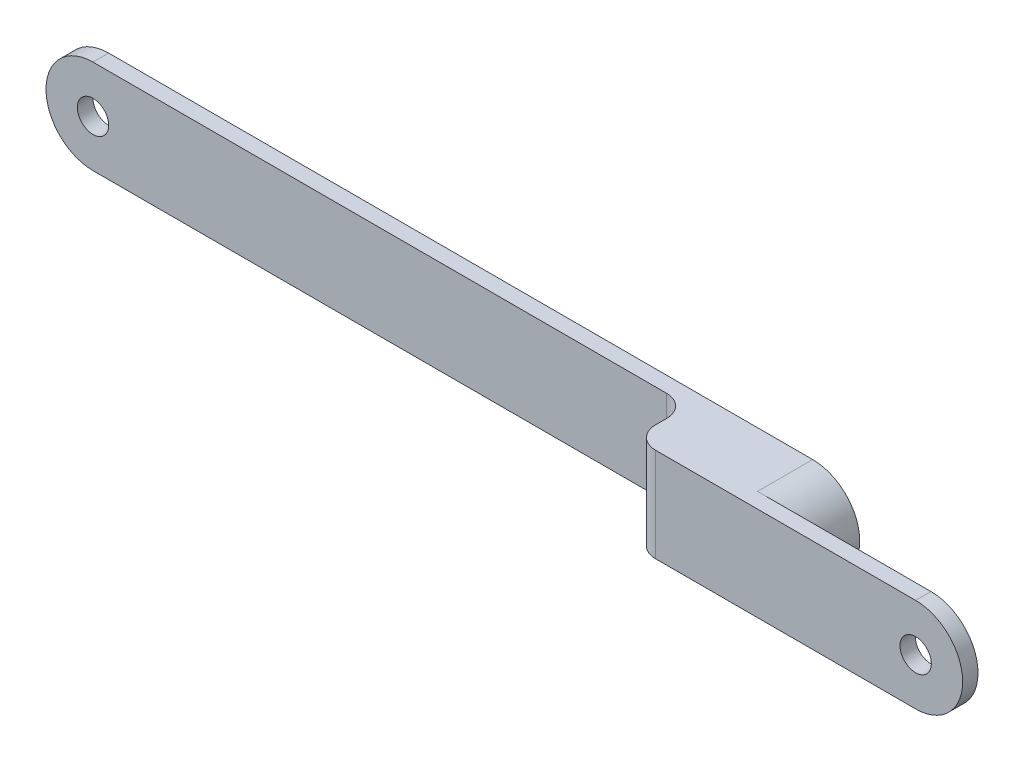
ISO-10303-21;
HEADER;
FILE_DESCRIPTION(('STEP AP214'),'2;1');
FILE_NAME('part.step','',(''),(''),'','','');
FILE_SCHEMA(('AUTOMOTIVE_DESIGN { 1 0 10303 214 1 1 1 1 }'));
ENDSEC;
DATA;
#1=APPLICATION_CONTEXT('core data for automotive mechanical design processes');
#2=APPLICATION_PROTOCOL_DEFINITION('international standard','automotive_design',2000,#1);
#3=PRODUCT_CONTEXT('',#1,'mechanical');
#4=PRODUCT('Part','Part','',(#3));
#5=PRODUCT_RELATED_PRODUCT_CATEGORY('part','',(#4));
#6=PRODUCT_DEFINITION_FORMATION('','',#4);
#7=PRODUCT_DEFINITION_CONTEXT('part definition',#1,'design');
#8=PRODUCT_DEFINITION('design','',#6,#7);
#9=PRODUCT_DEFINITION_SHAPE('','',#8);
#10=(LENGTH_UNIT() NAMED_UNIT(*) SI_UNIT(.MILLI.,.METRE.));
#11=(NAMED_UNIT(*) PLANE_ANGLE_UNIT() SI_UNIT($,.RADIAN.));
#12=(NAMED_UNIT(*) SI_UNIT($,.STERADIAN.) SOLID_ANGLE_UNIT());
#13=UNCERTAINTY_MEASURE_WITH_UNIT(LENGTH_MEASURE(1.E-05),#10,'distance_accuracy_value','');
#14=(GEOMETRIC_REPRESENTATION_CONTEXT(3) GLOBAL_UNCERTAINTY_ASSIGNED_CONTEXT((#13)) GLOBAL_UNIT_ASSIGNED_CONTEXT((#10,
#11,#12)) REPRESENTATION_CONTEXT('',''));
#15=CARTESIAN_POINT('',(0.,0.,0.));
#16=DIRECTION('',(0.,0.,1.));
#17=DIRECTION('',(1.,0.,0.));
#18=AXIS2_PLACEMENT_3D('',#15,#16,#17);
#19=CARTESIAN_POINT('',(0.,15.,45.));
#20=DIRECTION('',(0.,-1.,0.));
#21=DIRECTION('',(0.,0.,-1.));
#22=AXIS2_PLACEMENT_3D('',#19,#20,#21);
#23=PLANE('',#22);
#24=DIRECTION('',(0.,0.,-1.));
#25=VECTOR('',#24,1.);
#26=CARTESIAN_POINT('',(224.645366828327,15.,71.7728992395155));
#27=LINE('',#26,#25);
#28=CARTESIAN_POINT('',(224.645366828327,15.,17.6));
#29=VERTEX_POINT('',#28);
#30=CARTESIAN_POINT('',(224.645366828327,15.,0.));
#31=VERTEX_POINT('',#30);
#32=EDGE_CURVE('E117',#29,#31,#27,.T.);
#33=ORIENTED_EDGE('',*,*,#32,.T.);
#34=DIRECTION('',(-1.,0.,0.));
#35=VECTOR('',#34,1.);
#36=CARTESIAN_POINT('',(0.,15.,0.));
#37=LINE('',#36,#35);
#38=CARTESIAN_POINT('',(0.,15.,0.));
#39=VERTEX_POINT('',#38);
#40=EDGE_CURVE('E128',#31,#39,#37,.T.);
#41=ORIENTED_EDGE('',*,*,#40,.T.);
#42=DIRECTION('',(0.,0.,-1.));
#43=VECTOR('',#42,1.);
#44=CARTESIAN_POINT('',(0.,15.,45.));
#45=LINE('',#44,#43);
#46=CARTESIAN_POINT('',(0.,15.,5.00000000000004));
#47=VERTEX_POINT('',#46);
#48=EDGE_CURVE('E134',#47,#39,#45,.T.);
#49=ORIENTED_EDGE('',*,*,#48,.F.);
#50=DIRECTION('',(-1.,0.,0.));
#51=VECTOR('',#50,1.);
#52=CARTESIAN_POINT('',(0.,15.,5.00000000000004));
#53=LINE('',#52,#51);
#54=CARTESIAN_POINT('',(183.,15.,5.00000000000006));
#55=VERTEX_POINT('',#54);
#56=EDGE_CURVE('E152',#55,#47,#53,.T.);
#57=ORIENTED_EDGE('',*,*,#56,.F.);
#58=CARTESIAN_POINT('',(183.,15.,12.0000000000001));
#59=DIRECTION('',(0.,-1.,0.));
#60=DIRECTION('',(0.,0.,-1.));
#61=AXIS2_PLACEMENT_3D('',#58,#59,#60);
#62=CIRCLE('',#61,7.);
#63=CARTESIAN_POINT('',(190.,15.,12.0000000000001));
#64=VERTEX_POINT('',#63);
#65=EDGE_CURVE('E174',#55,#64,#62,.T.);
#66=ORIENTED_EDGE('',*,*,#65,.T.);
#67=DIRECTION('',(0.,0.,-1.));
#68=VECTOR('',#67,1.);
#69=CARTESIAN_POINT('',(190.,15.,45.));
#70=LINE('',#69,#68);
#71=CARTESIAN_POINT('',(190.,15.,15.5));
#72=VERTEX_POINT('',#71);
#73=EDGE_CURVE('E156',#72,#64,#70,.T.);
#74=ORIENTED_EDGE('',*,*,#73,.F.);
#75=CARTESIAN_POINT('',(197.,15.,15.5));
#76=DIRECTION('',(0.,-1.,0.));
#77=DIRECTION('',(0.,0.,-1.));
#78=AXIS2_PLACEMENT_3D('',#75,#76,#77);
#79=CIRCLE('',#78,7.);
#80=CARTESIAN_POINT('',(197.,15.,22.5));
#81=VERTEX_POINT('',#80);
#82=EDGE_CURVE('E169',#72,#81,#79,.F.);
#83=ORIENTED_EDGE('',*,*,#82,.T.);
#84=DIRECTION('',(-1.,0.,0.));
#85=VECTOR('',#84,1.);
#86=CARTESIAN_POINT('',(0.,15.,22.5000000000001));
#87=LINE('',#86,#85);
#88=CARTESIAN_POINT('',(280.,15.,22.5000000000001));
#89=VERTEX_POINT('',#88);
#90=EDGE_CURVE('E144',#89,#81,#87,.T.);
#91=ORIENTED_EDGE('',*,*,#90,.F.);
#92=DIRECTION('',(0.,0.,1.));
#93=VECTOR('',#92,1.);
#94=CARTESIAN_POINT('',(280.,15.,-99.6242942258564));
#95=LINE('',#94,#93);
#96=CARTESIAN_POINT('',(280.,15.,17.6));
#97=VERTEX_POINT('',#96);
#98=EDGE_CURVE('E191',#97,#89,#95,.T.);
#99=ORIENTED_EDGE('',*,*,#98,.F.);
#100=DIRECTION('',(-1.,0.,0.));
#101=VECTOR('',#100,1.);
#102=CARTESIAN_POINT('',(280.,15.,17.6));
#103=LINE('',#102,#101);
#104=EDGE_CURVE('E12',#97,#29,#103,.T.);
#105=ORIENTED_EDGE('',*,*,#104,.T.);
#106=EDGE_LOOP('',(#33,#41,#49,#57,#66,#74,#83,#91,#99,#105));
#107=FACE_BOUND('',#106,.T.);
#108=ADVANCED_FACE('F36',(#107),#23,.F.);
#109=CARTESIAN_POINT('',(280.,0.,-99.6242942258564));
#110=DIRECTION('',(0.,0.,1.));
#111=DIRECTION('',(1.,0.,0.));
#112=AXIS2_PLACEMENT_3D('',#109,#110,#111);
#113=CYLINDRICAL_SURFACE('',#112,15.);
#114=DIRECTION('',(0.,0.,1.));
#115=VECTOR('',#114,1.);
#116=CARTESIAN_POINT('',(280.,-15.,-99.6242942258564));
#117=LINE('',#116,#115);
#118=CARTESIAN_POINT('',(280.,-15.,17.6));
#119=VERTEX_POINT('',#118);
#120=CARTESIAN_POINT('',(280.,-15.,22.5000000000001));
#121=VERTEX_POINT('',#120);
#122=EDGE_CURVE('E179',#119,#121,#117,.T.);
#123=ORIENTED_EDGE('',*,*,#122,.F.);
#124=CARTESIAN_POINT('',(280.,0.,17.6));
#125=DIRECTION('',(0.,0.,-1.));
#126=DIRECTION('',(-1.,0.,0.));
#127=AXIS2_PLACEMENT_3D('',#124,#125,#126);
#128=CIRCLE('',#127,15.);
#129=EDGE_CURVE('E182',#97,#119,#128,.T.);
#130=ORIENTED_EDGE('',*,*,#129,.F.);
#131=ORIENTED_EDGE('',*,*,#98,.T.);
#132=CARTESIAN_POINT('',(280.,0.,22.5000000000001));
#133=DIRECTION('',(0.,0.,1.));
#134=DIRECTION('',(-1.,0.,0.));
#135=AXIS2_PLACEMENT_3D('',#132,#133,#134);
#136=CIRCLE('',#135,15.);
#137=EDGE_CURVE('E185',#121,#89,#136,.T.);
#138=ORIENTED_EDGE('',*,*,#137,.F.);
#139=EDGE_LOOP('',(#123,#130,#131,#138));
#140=FACE_BOUND('',#139,.T.);
#141=ADVANCED_FACE('F189',(#140),#113,.T.);
#142=CARTESIAN_POINT('',(0.,0.,45.));
#143=DIRECTION('',(0.,0.,-1.));
#144=DIRECTION('',(-1.,0.,0.));
#145=AXIS2_PLACEMENT_3D('',#142,#143,#144);
#146=CYLINDRICAL_SURFACE('',#145,15.);
#147=CARTESIAN_POINT('',(0.,0.,5.00000000000004));
#148=DIRECTION('',(0.,0.,1.));
#149=DIRECTION('',(1.,0.,0.));
#150=AXIS2_PLACEMENT_3D('',#147,#148,#149);
#151=CIRCLE('',#150,15.);
#152=CARTESIAN_POINT('',(0.,-15.,5.00000000000003));
#153=VERTEX_POINT('',#152);
#154=EDGE_CURVE('E148',#47,#153,#151,.T.);
#155=ORIENTED_EDGE('',*,*,#154,.F.);
#156=ORIENTED_EDGE('',*,*,#48,.T.);
#157=CARTESIAN_POINT('',(0.,0.,0.));
#158=DIRECTION('',(0.,0.,1.));
#159=DIRECTION('',(1.,0.,0.));
#160=AXIS2_PLACEMENT_3D('',#157,#158,#159);
#161=CIRCLE('',#160,15.);
#162=CARTESIAN_POINT('',(0.,-15.,0.));
#163=VERTEX_POINT('',#162);
#164=EDGE_CURVE('E133',#39,#163,#161,.T.);
#165=ORIENTED_EDGE('',*,*,#164,.T.);
#166=DIRECTION('',(0.,0.,-1.));
#167=VECTOR('',#166,1.);
#168=CARTESIAN_POINT('',(0.,-15.,45.));
#169=LINE('',#168,#167);
#170=EDGE_CURVE('E137',#153,#163,#169,.T.);
#171=ORIENTED_EDGE('',*,*,#170,.F.);
#172=EDGE_LOOP('',(#155,#156,#165,#171));
#173=FACE_BOUND('',#172,.T.);
#174=ADVANCED_FACE('F207',(#173),#146,.T.);
#175=CARTESIAN_POINT('',(0.,-15.,45.));
#176=DIRECTION('',(0.,1.,0.));
#177=DIRECTION('',(0.,0.,1.));
#178=AXIS2_PLACEMENT_3D('',#175,#176,#177);
#179=PLANE('',#178);
#180=DIRECTION('',(1.,0.,0.));
#181=VECTOR('',#180,1.);
#182=CARTESIAN_POINT('',(0.,-15.,0.));
#183=LINE('',#182,#181);
#184=CARTESIAN_POINT('',(224.645366828327,-15.,0.));
#185=VERTEX_POINT('',#184);
#186=EDGE_CURVE('E135',#163,#185,#183,.T.);
#187=ORIENTED_EDGE('',*,*,#186,.T.);
#188=DIRECTION('',(0.,0.,-1.));
#189=VECTOR('',#188,1.);
#190=CARTESIAN_POINT('',(224.645366828327,-15.,71.7728992395155));
#191=LINE('',#190,#189);
#192=CARTESIAN_POINT('',(224.645366828327,-15.,17.6));
#193=VERTEX_POINT('',#192);
#194=EDGE_CURVE('E119',#193,#185,#191,.T.);
#195=ORIENTED_EDGE('',*,*,#194,.F.);
#196=DIRECTION('',(1.,0.,0.));
#197=VECTOR('',#196,1.);
#198=CARTESIAN_POINT('',(280.,-15.,17.6));
#199=LINE('',#198,#197);
#200=EDGE_CURVE('E44',#193,#119,#199,.T.);
#201=ORIENTED_EDGE('',*,*,#200,.T.);
#202=ORIENTED_EDGE('',*,*,#122,.T.);
#203=DIRECTION('',(-1.,0.,0.));
#204=VECTOR('',#203,1.);
#205=CARTESIAN_POINT('',(215.,-15.,22.5));
#206=LINE('',#205,#204);
#207=CARTESIAN_POINT('',(197.,-15.,22.5));
#208=VERTEX_POINT('',#207);
#209=EDGE_CURVE('E193',#121,#208,#206,.T.);
#210=ORIENTED_EDGE('',*,*,#209,.T.);
#211=CARTESIAN_POINT('',(197.,-15.,15.5));
#212=DIRECTION('',(0.,1.,0.));
#213=DIRECTION('',(0.,0.,1.));
#214=AXIS2_PLACEMENT_3D('',#211,#212,#213);
#215=CIRCLE('',#214,7.);
#216=CARTESIAN_POINT('',(190.,-15.,15.5));
#217=VERTEX_POINT('',#216);
#218=EDGE_CURVE('E162',#208,#217,#215,.F.);
#219=ORIENTED_EDGE('',*,*,#218,.T.);
#220=DIRECTION('',(0.,0.,-1.));
#221=VECTOR('',#220,1.);
#222=CARTESIAN_POINT('',(190.,-15.,22.5));
#223=LINE('',#222,#221);
#224=CARTESIAN_POINT('',(190.,-15.,12.0000000000001));
#225=VERTEX_POINT('',#224);
#226=EDGE_CURVE('E198',#217,#225,#223,.T.);
#227=ORIENTED_EDGE('',*,*,#226,.T.);
#228=CARTESIAN_POINT('',(183.,-15.,12.0000000000001));
#229=DIRECTION('',(0.,1.,0.));
#230=DIRECTION('',(0.,0.,1.));
#231=AXIS2_PLACEMENT_3D('',#228,#229,#230);
#232=CIRCLE('',#231,7.);
#233=CARTESIAN_POINT('',(183.,-15.,5.00000000000005));
#234=VERTEX_POINT('',#233);
#235=EDGE_CURVE('E172',#225,#234,#232,.T.);
#236=ORIENTED_EDGE('',*,*,#235,.T.);
#237=DIRECTION('',(-1.,0.,0.));
#238=VECTOR('',#237,1.);
#239=CARTESIAN_POINT('',(190.,-15.,5.00000000000005));
#240=LINE('',#239,#238);
#241=EDGE_CURVE('E153',#234,#153,#240,.T.);
#242=ORIENTED_EDGE('',*,*,#241,.T.);
#243=ORIENTED_EDGE('',*,*,#170,.T.);
#244=EDGE_LOOP('',(#187,#195,#201,#202,#210,#219,#227,#236,#242,#243));
#245=FACE_BOUND('',#244,.T.);
#246=ADVANCED_FACE('F176',(#245),#179,.F.);
#247=CARTESIAN_POINT('',(0.,0.,-45.));
#248=DIRECTION('',(0.,0.,1.));
#249=DIRECTION('',(1.,0.,0.));
#250=AXIS2_PLACEMENT_3D('',#247,#248,#249);
#251=CYLINDRICAL_SURFACE('',#250,5.);
#252=CARTESIAN_POINT('',(0.,0.,0.));
#253=DIRECTION('',(0.,0.,1.));
#254=DIRECTION('',(1.,0.,0.));
#255=AXIS2_PLACEMENT_3D('',#252,#253,#254);
#256=CIRCLE('',#255,5.);
#257=CARTESIAN_POINT('',(5.,0.,0.));
#258=VERTEX_POINT('',#257);
#259=EDGE_CURVE('E145',#258,#258,#256,.T.);
#260=CARTESIAN_POINT('',(0.,0.,5.00000000000003));
#261=DIRECTION('',(0.,0.,1.));
#262=DIRECTION('',(1.,0.,0.));
#263=AXIS2_PLACEMENT_3D('',#260,#261,#262);
#264=CIRCLE('',#263,5.);
#265=CARTESIAN_POINT('',(5.,0.,5.00000000000003));
#266=VERTEX_POINT('',#265);
#267=EDGE_CURVE('E149',#266,#266,#264,.F.);
#268=CARTESIAN_POINT('',(5.,0.,0.));
#269=CARTESIAN_POINT('',(5.,0.,0.0520833333333345));
#270=CARTESIAN_POINT('',(5.,0.,0.104166666666669));
#271=CARTESIAN_POINT('',(5.,0.,0.208333333333336));
#272=CARTESIAN_POINT('',(5.,0.,0.260416666666668));
#273=CARTESIAN_POINT('',(5.,0.,0.364583333333335));
#274=CARTESIAN_POINT('',(5.,0.,0.416666666666669));
#275=CARTESIAN_POINT('',(5.,0.,0.520833333333336));
#276=CARTESIAN_POINT('',(5.,0.,0.572916666666668));
#277=CARTESIAN_POINT('',(5.,0.,0.677083333333335));
#278=CARTESIAN_POINT('',(5.,0.,0.72916666666667));
#279=CARTESIAN_POINT('',(5.,0.,0.833333333333339));
#280=CARTESIAN_POINT('',(5.,0.,0.885416666666673));
#281=CARTESIAN_POINT('',(5.,0.,0.98958333333334));
#282=CARTESIAN_POINT('',(5.,0.,1.04166666666667));
#283=CARTESIAN_POINT('',(5.,0.,1.14583333333334));
#284=CARTESIAN_POINT('',(5.,0.,1.19791666666667));
#285=CARTESIAN_POINT('',(5.,0.,1.30208333333334));
#286=CARTESIAN_POINT('',(5.,0.,1.35416666666668));
#287=CARTESIAN_POINT('',(5.,0.,1.45833333333334));
#288=CARTESIAN_POINT('',(5.,0.,1.51041666666668));
#289=CARTESIAN_POINT('',(5.,0.,1.61458333333334));
#290=CARTESIAN_POINT('',(5.,0.,1.66666666666668));
#291=CARTESIAN_POINT('',(5.,0.,1.77083333333335));
#292=CARTESIAN_POINT('',(5.,0.,1.82291666666668));
#293=CARTESIAN_POINT('',(5.,0.,1.92708333333335));
#294=CARTESIAN_POINT('',(5.,0.,1.97916666666668));
#295=CARTESIAN_POINT('',(5.,0.,2.08333333333335));
#296=CARTESIAN_POINT('',(5.,0.,2.13541666666668));
#297=CARTESIAN_POINT('',(5.,0.,2.23958333333335));
#298=CARTESIAN_POINT('',(5.,0.,2.29166666666668));
#299=CARTESIAN_POINT('',(5.,0.,2.39583333333335));
#300=CARTESIAN_POINT('',(5.,0.,2.44791666666668));
#301=CARTESIAN_POINT('',(5.,0.,2.55208333333335));
#302=CARTESIAN_POINT('',(5.,0.,2.60416666666669));
#303=CARTESIAN_POINT('',(5.,0.,2.70833333333335));
#304=CARTESIAN_POINT('',(5.,0.,2.76041666666668));
#305=CARTESIAN_POINT('',(5.,0.,2.86458333333335));
#306=CARTESIAN_POINT('',(5.,0.,2.91666666666669));
#307=CARTESIAN_POINT('',(5.,0.,3.02083333333335));
#308=CARTESIAN_POINT('',(5.,0.,3.07291666666668));
#309=CARTESIAN_POINT('',(5.,0.,3.17708333333335));
#310=CARTESIAN_POINT('',(5.,0.,3.22916666666669));
#311=CARTESIAN_POINT('',(5.,0.,3.33333333333335));
#312=CARTESIAN_POINT('',(5.,0.,3.38541666666669));
#313=CARTESIAN_POINT('',(5.,0.,3.48958333333336));
#314=CARTESIAN_POINT('',(5.,0.,3.54166666666669));
#315=CARTESIAN_POINT('',(5.,0.,3.64583333333336));
#316=CARTESIAN_POINT('',(5.,0.,3.69791666666669));
#317=CARTESIAN_POINT('',(5.,0.,3.80208333333336));
#318=CARTESIAN_POINT('',(5.,0.,3.85416666666669));
#319=CARTESIAN_POINT('',(5.,0.,3.95833333333336));
#320=CARTESIAN_POINT('',(5.,0.,4.01041666666669));
#321=CARTESIAN_POINT('',(5.,0.,4.11458333333336));
#322=CARTESIAN_POINT('',(5.,0.,4.16666666666669));
#323=CARTESIAN_POINT('',(5.,0.,4.27083333333336));
#324=CARTESIAN_POINT('',(5.,0.,4.3229166666667));
#325=CARTESIAN_POINT('',(5.,0.,4.42708333333336));
#326=CARTESIAN_POINT('',(5.,0.,4.4791666666667));
#327=CARTESIAN_POINT('',(5.,0.,4.58333333333336));
#328=CARTESIAN_POINT('',(5.,0.,4.6354166666667));
#329=CARTESIAN_POINT('',(5.,0.,4.73958333333336));
#330=CARTESIAN_POINT('',(5.,0.,4.7916666666667));
#331=CARTESIAN_POINT('',(5.,0.,4.89583333333336));
#332=CARTESIAN_POINT('',(5.,0.,4.9479166666667));
#333=CARTESIAN_POINT('',(5.,0.,5.00000000000003));
#334=B_SPLINE_CURVE_WITH_KNOTS('',3,(#268,#269,#270,#271,#272,#273,#274,#275,#276,#277,#278,
#279,#280,#281,#282,#283,#284,#285,#286,#287,#288,#289,#290,#291,#292,#293,#294,#295,#296,#297,
#298,#299,#300,#301,#302,#303,#304,#305,#306,#307,#308,#309,#310,#311,#312,#313,#314,#315,#316,
#317,#318,#319,#320,#321,#322,#323,#324,#325,#326,#327,#328,#329,#330,#331,#332,#333),
.UNSPECIFIED.,.F.,.F.,(4,2,2,2,2,2,2,2,2,2,2,2,2,2,2,2,2,2,2,2,2,2,2,2,2,2,2,2,2,2,2,2,4),(0.,
0.156250000000004,0.3125,0.468750000000004,0.625000000000001,0.781250000000004,
0.937500000000008,1.09375,1.25000000000001,1.40625000000001,1.56250000000001,1.71875000000001,
1.87500000000002,2.03125000000001,2.18750000000002,2.34375000000001,2.50000000000002,
2.65625000000002,2.81250000000002,2.96875000000002,3.12500000000002,3.28125000000002,
3.43750000000002,3.59375000000002,3.75000000000002,3.90625000000003,4.06250000000002,
4.21875000000003,4.37500000000003,4.53125000000003,4.68750000000003,4.84375000000003,
5.00000000000003),.UNSPECIFIED.);
#335=EDGE_CURVE('BSEAM246',#258,#266,#334,.T.);
#336=ORIENTED_EDGE('',*,*,#259,.F.);
#337=ORIENTED_EDGE('',*,*,#267,.F.);
#338=ORIENTED_EDGE('',*,*,#335,.T.);
#339=ORIENTED_EDGE('',*,*,#335,.F.);
#340=EDGE_LOOP('',(#336,#338,#337,#339));
#341=FACE_BOUND('',#340,.T.);
#342=ADVANCED_FACE('F246',(#341),#251,.F.);
#343=CARTESIAN_POINT('',(0.,0.,0.));
#344=DIRECTION('',(0.,0.,1.));
#345=DIRECTION('',(1.,0.,0.));
#346=AXIS2_PLACEMENT_3D('',#343,#344,#345);
#347=PLANE('',#346);
#348=ORIENTED_EDGE('',*,*,#259,.T.);
#349=EDGE_LOOP('',(#348));
#350=FACE_BOUND('',#349,.T.);
#351=ORIENTED_EDGE('',*,*,#40,.F.);
#352=CARTESIAN_POINT('',(224.645366828327,0.,0.));
#353=DIRECTION('',(0.,0.,1.));
#354=DIRECTION('',(1.,0.,0.));
#355=AXIS2_PLACEMENT_3D('',#352,#353,#354);
#356=CIRCLE('',#355,15.);
#357=EDGE_CURVE('E113',#185,#31,#356,.T.);
#358=ORIENTED_EDGE('',*,*,#357,.F.);
#359=ORIENTED_EDGE('',*,*,#186,.F.);
#360=ORIENTED_EDGE('',*,*,#164,.F.);
#361=EDGE_LOOP('',(#351,#358,#359,#360));
#362=FACE_BOUND('',#361,.T.);
#363=ADVANCED_FACE('F132',(#350,#362),#347,.F.);
#364=CARTESIAN_POINT('',(190.,35.,22.5));
#365=DIRECTION('',(-1.,0.,0.));
#366=DIRECTION('',(0.,0.,1.));
#367=AXIS2_PLACEMENT_3D('',#364,#365,#366);
#368=PLANE('',#367);
#369=ORIENTED_EDGE('',*,*,#226,.F.);
#370=DIRECTION('',(0.,-1.,0.));
#371=VECTOR('',#370,1.);
#372=CARTESIAN_POINT('',(190.,35.,15.5));
#373=LINE('',#372,#371);
#374=EDGE_CURVE('E167',#217,#72,#373,.F.);
#375=ORIENTED_EDGE('',*,*,#374,.T.);
#376=ORIENTED_EDGE('',*,*,#73,.T.);
#377=DIRECTION('',(0.,-1.,0.));
#378=VECTOR('',#377,1.);
#379=CARTESIAN_POINT('',(190.,-15.,12.0000000000001));
#380=LINE('',#379,#378);
#381=EDGE_CURVE('E164',#64,#225,#380,.T.);
#382=ORIENTED_EDGE('',*,*,#381,.T.);
#383=EDGE_LOOP('',(#369,#375,#376,#382));
#384=FACE_BOUND('',#383,.T.);
#385=ADVANCED_FACE('F215',(#384),#368,.T.);
#386=CARTESIAN_POINT('',(215.,35.,22.5));
#387=DIRECTION('',(0.,0.,1.));
#388=DIRECTION('',(1.,0.,0.));
#389=AXIS2_PLACEMENT_3D('',#386,#387,#388);
#390=PLANE('',#389);
#391=CARTESIAN_POINT('',(280.,0.,22.5));
#392=DIRECTION('',(0.,0.,1.));
#393=DIRECTION('',(1.,0.,0.));
#394=AXIS2_PLACEMENT_3D('',#391,#392,#393);
#395=CIRCLE('',#394,4.99999999999999);
#396=CARTESIAN_POINT('',(275.,0.,22.5));
#397=VERTEX_POINT('',#396);
#398=EDGE_CURVE('E124',#397,#397,#395,.T.);
#399=ORIENTED_EDGE('',*,*,#398,.F.);
#400=EDGE_LOOP('',(#399));
#401=FACE_BOUND('',#400,.T.);
#402=ORIENTED_EDGE('',*,*,#209,.F.);
#403=ORIENTED_EDGE('',*,*,#137,.T.);
#404=ORIENTED_EDGE('',*,*,#90,.T.);
#405=DIRECTION('',(0.,-1.,0.));
#406=VECTOR('',#405,1.);
#407=CARTESIAN_POINT('',(197.,35.,22.5));
#408=LINE('',#407,#406);
#409=EDGE_CURVE('E159',#81,#208,#408,.T.);
#410=ORIENTED_EDGE('',*,*,#409,.T.);
#411=EDGE_LOOP('',(#402,#403,#404,#410));
#412=FACE_BOUND('',#411,.T.);
#413=ADVANCED_FACE('F222',(#401,#412),#390,.T.);
#414=CARTESIAN_POINT('',(190.,35.,5.00000000000005));
#415=DIRECTION('',(0.,0.,1.));
#416=DIRECTION('',(1.,0.,0.));
#417=AXIS2_PLACEMENT_3D('',#414,#415,#416);
#418=PLANE('',#417);
#419=ORIENTED_EDGE('',*,*,#267,.T.);
#420=EDGE_LOOP('',(#419));
#421=FACE_BOUND('',#420,.T.);
#422=ORIENTED_EDGE('',*,*,#241,.F.);
#423=DIRECTION('',(0.,-1.,0.));
#424=VECTOR('',#423,1.);
#425=CARTESIAN_POINT('',(183.,15.,5.00000000000005));
#426=LINE('',#425,#424);
#427=EDGE_CURVE('E57',#234,#55,#426,.F.);
#428=ORIENTED_EDGE('',*,*,#427,.T.);
#429=ORIENTED_EDGE('',*,*,#56,.T.);
#430=ORIENTED_EDGE('',*,*,#154,.T.);
#431=EDGE_LOOP('',(#422,#428,#429,#430));
#432=FACE_BOUND('',#431,.T.);
#433=ADVANCED_FACE('F208',(#421,#432),#418,.T.);
#434=CARTESIAN_POINT('',(197.,35.,15.5));
#435=DIRECTION('',(0.,-1.,0.));
#436=DIRECTION('',(0.,0.,-1.));
#437=AXIS2_PLACEMENT_3D('',#434,#435,#436);
#438=CYLINDRICAL_SURFACE('',#437,7.);
#439=ORIENTED_EDGE('',*,*,#82,.F.);
#440=ORIENTED_EDGE('',*,*,#374,.F.);
#441=ORIENTED_EDGE('',*,*,#218,.F.);
#442=ORIENTED_EDGE('',*,*,#409,.F.);
#443=EDGE_LOOP('',(#439,#440,#441,#442));
#444=FACE_BOUND('',#443,.T.);
#445=ADVANCED_FACE('F220',(#444),#438,.T.);
#446=CARTESIAN_POINT('',(183.,35.,12.0000000000001));
#447=DIRECTION('',(0.,1.,0.));
#448=DIRECTION('',(0.,0.,1.));
#449=AXIS2_PLACEMENT_3D('',#446,#447,#448);
#450=CYLINDRICAL_SURFACE('',#449,7.);
#451=ORIENTED_EDGE('',*,*,#65,.F.);
#452=ORIENTED_EDGE('',*,*,#427,.F.);
#453=ORIENTED_EDGE('',*,*,#235,.F.);
#454=ORIENTED_EDGE('',*,*,#381,.F.);
#455=EDGE_LOOP('',(#451,#452,#453,#454));
#456=FACE_BOUND('',#455,.T.);
#457=ADVANCED_FACE('F38',(#456),#450,.F.);
#458=CARTESIAN_POINT('',(280.,0.,17.6));
#459=DIRECTION('',(0.,0.,-1.));
#460=DIRECTION('',(-1.,0.,0.));
#461=AXIS2_PLACEMENT_3D('',#458,#459,#460);
#462=PLANE('',#461);
#463=CARTESIAN_POINT('',(280.,0.,17.6));
#464=DIRECTION('',(0.,0.,-1.));
#465=DIRECTION('',(-1.,0.,0.));
#466=AXIS2_PLACEMENT_3D('',#463,#464,#465);
#467=CIRCLE('',#466,4.99999999999999);
#468=CARTESIAN_POINT('',(275.,0.,17.6));
#469=VERTEX_POINT('',#468);
#470=EDGE_CURVE('E271',#469,#469,#467,.T.);
#471=ORIENTED_EDGE('',*,*,#470,.F.);
#472=EDGE_LOOP('',(#471));
#473=FACE_BOUND('',#472,.T.);
#474=ORIENTED_EDGE('',*,*,#129,.T.);
#475=ORIENTED_EDGE('',*,*,#200,.F.);
#476=CARTESIAN_POINT('',(224.645366828327,0.,17.6));
#477=DIRECTION('',(0.,0.,-1.));
#478=DIRECTION('',(-1.,0.,0.));
#479=AXIS2_PLACEMENT_3D('',#476,#477,#478);
#480=CIRCLE('',#479,15.);
#481=EDGE_CURVE('E186',#29,#193,#480,.T.);
#482=ORIENTED_EDGE('',*,*,#481,.F.);
#483=ORIENTED_EDGE('',*,*,#104,.F.);
#484=EDGE_LOOP('',(#474,#475,#482,#483));
#485=FACE_BOUND('',#484,.T.);
#486=ADVANCED_FACE('F183',(#473,#485),#462,.T.);
#487=CARTESIAN_POINT('',(224.645366828327,0.,71.7728992395155));
#488=DIRECTION('',(0.,0.,-1.));
#489=DIRECTION('',(-1.,0.,0.));
#490=AXIS2_PLACEMENT_3D('',#487,#488,#489);
#491=CYLINDRICAL_SURFACE('',#490,15.);
#492=ORIENTED_EDGE('',*,*,#481,.T.);
#493=ORIENTED_EDGE('',*,*,#194,.T.);
#494=ORIENTED_EDGE('',*,*,#357,.T.);
#495=ORIENTED_EDGE('',*,*,#32,.F.);
#496=EDGE_LOOP('',(#492,#493,#494,#495));
#497=FACE_BOUND('',#496,.T.);
#498=ADVANCED_FACE('F116',(#497),#491,.T.);
#499=CARTESIAN_POINT('',(280.,0.,32.6));
#500=DIRECTION('',(0.,0.,-1.));
#501=DIRECTION('',(-1.,0.,0.));
#502=AXIS2_PLACEMENT_3D('',#499,#500,#501);
#503=CYLINDRICAL_SURFACE('',#502,4.99999999999999);
#504=CARTESIAN_POINT('',(275.,0.,22.5));
#505=CARTESIAN_POINT('',(275.,0.,22.4489583333333));
#506=CARTESIAN_POINT('',(275.,0.,22.3979166666667));
#507=CARTESIAN_POINT('',(275.,0.,22.2958333333333));
#508=CARTESIAN_POINT('',(275.,0.,22.2447916666667));
#509=CARTESIAN_POINT('',(275.,0.,22.1427083333333));
#510=CARTESIAN_POINT('',(275.,0.,22.0916666666667));
#511=CARTESIAN_POINT('',(275.,0.,21.9895833333333));
#512=CARTESIAN_POINT('',(275.,0.,21.9385416666667));
#513=CARTESIAN_POINT('',(275.,0.,21.8364583333333));
#514=CARTESIAN_POINT('',(275.,0.,21.7854166666667));
#515=CARTESIAN_POINT('',(275.,0.,21.6833333333333));
#516=CARTESIAN_POINT('',(275.,0.,21.6322916666667));
#517=CARTESIAN_POINT('',(275.,0.,21.5302083333333));
#518=CARTESIAN_POINT('',(275.,0.,21.4791666666667));
#519=CARTESIAN_POINT('',(275.,0.,21.3770833333333));
#520=CARTESIAN_POINT('',(275.,0.,21.3260416666667));
#521=CARTESIAN_POINT('',(275.,0.,21.2239583333333));
#522=CARTESIAN_POINT('',(275.,0.,21.1729166666667));
#523=CARTESIAN_POINT('',(275.,0.,21.0708333333333));
#524=CARTESIAN_POINT('',(275.,0.,21.0197916666667));
#525=CARTESIAN_POINT('',(275.,0.,20.9177083333333));
#526=CARTESIAN_POINT('',(275.,0.,20.8666666666667));
#527=CARTESIAN_POINT('',(275.,0.,20.7645833333333));
#528=CARTESIAN_POINT('',(275.,0.,20.7135416666667));
#529=CARTESIAN_POINT('',(275.,0.,20.6114583333333));
#530=CARTESIAN_POINT('',(275.,0.,20.5604166666667));
#531=CARTESIAN_POINT('',(275.,0.,20.4583333333333));
#532=CARTESIAN_POINT('',(275.,0.,20.4072916666667));
#533=CARTESIAN_POINT('',(275.,0.,20.3052083333333));
#534=CARTESIAN_POINT('',(275.,0.,20.2541666666667));
#535=CARTESIAN_POINT('',(275.,0.,20.1520833333333));
#536=CARTESIAN_POINT('',(275.,0.,20.1010416666667));
#537=CARTESIAN_POINT('',(275.,0.,19.9989583333333));
#538=CARTESIAN_POINT('',(275.,0.,19.9479166666667));
#539=CARTESIAN_POINT('',(275.,0.,19.8458333333333));
#540=CARTESIAN_POINT('',(275.,0.,19.7947916666667));
#541=CARTESIAN_POINT('',(275.,0.,19.6927083333333));
#542=CARTESIAN_POINT('',(275.,0.,19.6416666666667));
#543=CARTESIAN_POINT('',(275.,0.,19.5395833333333));
#544=CARTESIAN_POINT('',(275.,0.,19.4885416666667));
#545=CARTESIAN_POINT('',(275.,0.,19.3864583333333));
#546=CARTESIAN_POINT('',(275.,0.,19.3354166666667));
#547=CARTESIAN_POINT('',(275.,0.,19.2333333333333));
#548=CARTESIAN_POINT('',(275.,0.,19.1822916666667));
#549=CARTESIAN_POINT('',(275.,0.,19.0802083333333));
#550=CARTESIAN_POINT('',(275.,0.,19.0291666666667));
#551=CARTESIAN_POINT('',(275.,0.,18.9270833333333));
#552=CARTESIAN_POINT('',(275.,0.,18.8760416666667));
#553=CARTESIAN_POINT('',(275.,0.,18.7739583333333));
#554=CARTESIAN_POINT('',(275.,0.,18.7229166666667));
#555=CARTESIAN_POINT('',(275.,0.,18.6208333333333));
#556=CARTESIAN_POINT('',(275.,0.,18.5697916666667));
#557=CARTESIAN_POINT('',(275.,0.,18.4677083333333));
#558=CARTESIAN_POINT('',(275.,0.,18.4166666666667));
#559=CARTESIAN_POINT('',(275.,0.,18.3145833333333));
#560=CARTESIAN_POINT('',(275.,0.,18.2635416666667));
#561=CARTESIAN_POINT('',(275.,0.,18.1614583333333));
#562=CARTESIAN_POINT('',(275.,0.,18.1104166666667));
#563=CARTESIAN_POINT('',(275.,0.,18.0083333333333));
#564=CARTESIAN_POINT('',(275.,0.,17.9572916666667));
#565=CARTESIAN_POINT('',(275.,0.,17.8552083333333));
#566=CARTESIAN_POINT('',(275.,0.,17.8041666666667));
#567=CARTESIAN_POINT('',(275.,0.,17.7020833333333));
#568=CARTESIAN_POINT('',(275.,0.,17.6510416666667));
#569=CARTESIAN_POINT('',(275.,0.,17.6));
#570=B_SPLINE_CURVE_WITH_KNOTS('',3,(#504,#505,#506,#507,#508,#509,#510,#511,#512,#513,#514,
#515,#516,#517,#518,#519,#520,#521,#522,#523,#524,#525,#526,#527,#528,#529,#530,#531,#532,#533,
#534,#535,#536,#537,#538,#539,#540,#541,#542,#543,#544,#545,#546,#547,#548,#549,#550,#551,#552,
#553,#554,#555,#556,#557,#558,#559,#560,#561,#562,#563,#564,#565,#566,#567,#568,#569),
.UNSPECIFIED.,.F.,.F.,(4,2,2,2,2,2,2,2,2,2,2,2,2,2,2,2,2,2,2,2,2,2,2,2,2,2,2,2,2,2,2,2,4),(0.,
0.153124999999997,0.306249999999997,0.459374999999998,0.612499999999995,0.765624999999999,
0.918749999999996,1.071875,1.225,1.37812499999999,1.53125,1.68437499999999,1.8375,1.990625,
2.14374999999999,2.296875,2.44999999999999,2.60312499999999,2.75624999999999,2.90937499999999,
3.06249999999999,3.21562499999999,3.36874999999999,3.52187499999999,3.67499999999999,
3.82812499999999,3.98124999999999,4.13437499999999,4.28749999999999,4.44062499999999,
4.59374999999999,4.74687499999999,4.89999999999999),.UNSPECIFIED.);
#571=EDGE_CURVE('BSEAM260',#397,#469,#570,.T.);
#572=ORIENTED_EDGE('',*,*,#398,.T.);
#573=ORIENTED_EDGE('',*,*,#470,.T.);
#574=ORIENTED_EDGE('',*,*,#571,.T.);
#575=ORIENTED_EDGE('',*,*,#571,.F.);
#576=EDGE_LOOP('',(#572,#574,#573,#575));
#577=FACE_BOUND('',#576,.T.);
#578=ADVANCED_FACE('F260',(#577),#503,.F.);
#579=CLOSED_SHELL('',(#108,#141,#174,#246,#342,#363,#385,#413,#433,#445,#457,#486,#498,#578));
#580=MANIFOLD_SOLID_BREP('B2',#579);
#581=ADVANCED_BREP_SHAPE_REPRESENTATION('',(#18,#580),#14);
#582=SHAPE_DEFINITION_REPRESENTATION(#9,#581);
ENDSEC;
END-ISO-10303-21;
